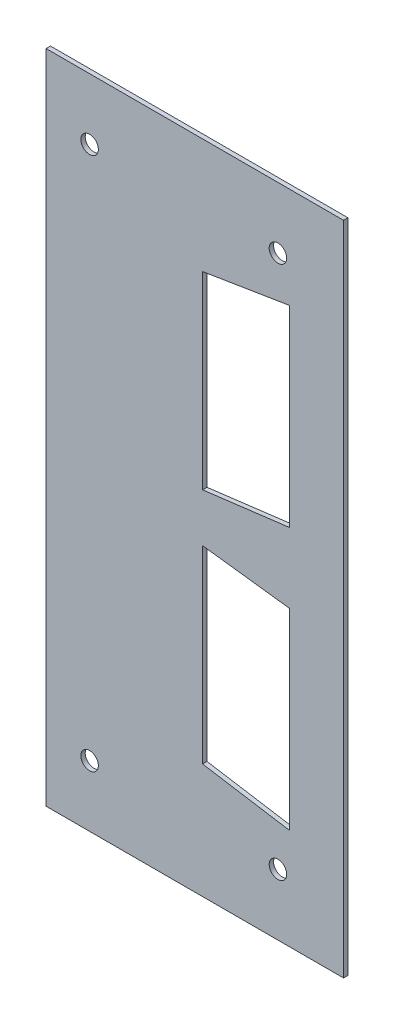
ISO-10303-21;
HEADER;
FILE_DESCRIPTION(('STEP AP214'),'2;1');
FILE_NAME('part.step','',(''),(''),'','','');
FILE_SCHEMA(('AUTOMOTIVE_DESIGN { 1 0 10303 214 1 1 1 1 }'));
ENDSEC;
DATA;
#1=APPLICATION_CONTEXT('core data for automotive mechanical design processes');
#2=APPLICATION_PROTOCOL_DEFINITION('international standard','automotive_design',2000,#1);
#3=PRODUCT_CONTEXT('',#1,'mechanical');
#4=PRODUCT('Part','Part','',(#3));
#5=PRODUCT_RELATED_PRODUCT_CATEGORY('part','',(#4));
#6=PRODUCT_DEFINITION_FORMATION('','',#4);
#7=PRODUCT_DEFINITION_CONTEXT('part definition',#1,'design');
#8=PRODUCT_DEFINITION('design','',#6,#7);
#9=PRODUCT_DEFINITION_SHAPE('','',#8);
#10=(LENGTH_UNIT() NAMED_UNIT(*) SI_UNIT(.MILLI.,.METRE.));
#11=(NAMED_UNIT(*) PLANE_ANGLE_UNIT() SI_UNIT($,.RADIAN.));
#12=(NAMED_UNIT(*) SI_UNIT($,.STERADIAN.) SOLID_ANGLE_UNIT());
#13=UNCERTAINTY_MEASURE_WITH_UNIT(LENGTH_MEASURE(1.E-05),#10,'distance_accuracy_value','');
#14=(GEOMETRIC_REPRESENTATION_CONTEXT(3) GLOBAL_UNCERTAINTY_ASSIGNED_CONTEXT((#13)) GLOBAL_UNIT_ASSIGNED_CONTEXT((#10,
#11,#12)) REPRESENTATION_CONTEXT('',''));
#15=CARTESIAN_POINT('',(0.,0.,0.));
#16=DIRECTION('',(0.,0.,1.));
#17=DIRECTION('',(1.,0.,0.));
#18=AXIS2_PLACEMENT_3D('',#15,#16,#17);
#19=CARTESIAN_POINT('',(0.,0.,1.));
#20=DIRECTION('',(1.,0.,0.));
#21=DIRECTION('',(0.,0.,-1.));
#22=AXIS2_PLACEMENT_3D('',#19,#20,#21);
#23=PLANE('',#22);
#24=DIRECTION('',(0.,-1.,0.));
#25=VECTOR('',#24,1.);
#26=CARTESIAN_POINT('',(0.,0.,0.));
#27=LINE('',#26,#25);
#28=CARTESIAN_POINT('',(0.,150.,0.));
#29=VERTEX_POINT('',#28);
#30=CARTESIAN_POINT('',(0.,0.,0.));
#31=VERTEX_POINT('',#30);
#32=EDGE_CURVE('E219',#29,#31,#27,.T.);
#33=ORIENTED_EDGE('',*,*,#32,.T.);
#34=DIRECTION('',(0.,0.,-1.));
#35=VECTOR('',#34,1.);
#36=CARTESIAN_POINT('',(0.,0.,1.));
#37=LINE('',#36,#35);
#38=CARTESIAN_POINT('',(0.,0.,1.));
#39=VERTEX_POINT('',#38);
#40=EDGE_CURVE('E11',#39,#31,#37,.T.);
#41=ORIENTED_EDGE('',*,*,#40,.F.);
#42=DIRECTION('',(0.,-1.,0.));
#43=VECTOR('',#42,1.);
#44=CARTESIAN_POINT('',(0.,0.,1.));
#45=LINE('',#44,#43);
#46=CARTESIAN_POINT('',(0.,150.,1.));
#47=VERTEX_POINT('',#46);
#48=EDGE_CURVE('E222',#47,#39,#45,.T.);
#49=ORIENTED_EDGE('',*,*,#48,.F.);
#50=DIRECTION('',(0.,0.,-1.));
#51=VECTOR('',#50,1.);
#52=CARTESIAN_POINT('',(0.,150.,1.));
#53=LINE('',#52,#51);
#54=EDGE_CURVE('E232',#47,#29,#53,.T.);
#55=ORIENTED_EDGE('',*,*,#54,.T.);
#56=EDGE_LOOP('',(#33,#41,#49,#55));
#57=FACE_BOUND('',#56,.T.);
#58=ADVANCED_FACE('F39',(#57),#23,.F.);
#59=CARTESIAN_POINT('',(0.,0.,1.));
#60=DIRECTION('',(0.,1.,0.));
#61=DIRECTION('',(0.,0.,1.));
#62=AXIS2_PLACEMENT_3D('',#59,#60,#61);
#63=PLANE('',#62);
#64=DIRECTION('',(1.,0.,0.));
#65=VECTOR('',#64,1.);
#66=CARTESIAN_POINT('',(0.,0.,0.));
#67=LINE('',#66,#65);
#68=CARTESIAN_POINT('',(68.,0.,0.));
#69=VERTEX_POINT('',#68);
#70=EDGE_CURVE('E235',#31,#69,#67,.T.);
#71=ORIENTED_EDGE('',*,*,#70,.T.);
#72=DIRECTION('',(0.,0.,-1.));
#73=VECTOR('',#72,1.);
#74=CARTESIAN_POINT('',(68.,0.,1.));
#75=LINE('',#74,#73);
#76=CARTESIAN_POINT('',(68.,0.,1.));
#77=VERTEX_POINT('',#76);
#78=EDGE_CURVE('E46',#77,#69,#75,.T.);
#79=ORIENTED_EDGE('',*,*,#78,.F.);
#80=DIRECTION('',(1.,0.,0.));
#81=VECTOR('',#80,1.);
#82=CARTESIAN_POINT('',(0.,0.,1.));
#83=LINE('',#82,#81);
#84=EDGE_CURVE('E225',#39,#77,#83,.T.);
#85=ORIENTED_EDGE('',*,*,#84,.F.);
#86=ORIENTED_EDGE('',*,*,#40,.T.);
#87=EDGE_LOOP('',(#71,#79,#85,#86));
#88=FACE_BOUND('',#87,.T.);
#89=ADVANCED_FACE('F264',(#88),#63,.F.);
#90=CARTESIAN_POINT('',(68.,0.,1.));
#91=DIRECTION('',(-1.,0.,0.));
#92=DIRECTION('',(0.,0.,1.));
#93=AXIS2_PLACEMENT_3D('',#90,#91,#92);
#94=PLANE('',#93);
#95=DIRECTION('',(0.,1.,0.));
#96=VECTOR('',#95,1.);
#97=CARTESIAN_POINT('',(68.,0.,0.));
#98=LINE('',#97,#96);
#99=CARTESIAN_POINT('',(68.,150.,0.));
#100=VERTEX_POINT('',#99);
#101=EDGE_CURVE('E237',#69,#100,#98,.T.);
#102=ORIENTED_EDGE('',*,*,#101,.T.);
#103=DIRECTION('',(0.,0.,-1.));
#104=VECTOR('',#103,1.);
#105=CARTESIAN_POINT('',(68.,150.,1.));
#106=LINE('',#105,#104);
#107=CARTESIAN_POINT('',(68.,150.,1.));
#108=VERTEX_POINT('',#107);
#109=EDGE_CURVE('E242',#108,#100,#106,.T.);
#110=ORIENTED_EDGE('',*,*,#109,.F.);
#111=DIRECTION('',(0.,1.,0.));
#112=VECTOR('',#111,1.);
#113=CARTESIAN_POINT('',(68.,0.,1.));
#114=LINE('',#113,#112);
#115=EDGE_CURVE('E228',#77,#108,#114,.T.);
#116=ORIENTED_EDGE('',*,*,#115,.F.);
#117=ORIENTED_EDGE('',*,*,#78,.T.);
#118=EDGE_LOOP('',(#102,#110,#116,#117));
#119=FACE_BOUND('',#118,.T.);
#120=ADVANCED_FACE('F249',(#119),#94,.F.);
#121=CARTESIAN_POINT('',(0.,150.,1.));
#122=DIRECTION('',(0.,-1.,0.));
#123=DIRECTION('',(0.,0.,-1.));
#124=AXIS2_PLACEMENT_3D('',#121,#122,#123);
#125=PLANE('',#124);
#126=DIRECTION('',(-1.,0.,0.));
#127=VECTOR('',#126,1.);
#128=CARTESIAN_POINT('',(0.,150.,0.));
#129=LINE('',#128,#127);
#130=EDGE_CURVE('E226',#100,#29,#129,.T.);
#131=ORIENTED_EDGE('',*,*,#130,.T.);
#132=ORIENTED_EDGE('',*,*,#54,.F.);
#133=DIRECTION('',(-1.,0.,0.));
#134=VECTOR('',#133,1.);
#135=CARTESIAN_POINT('',(0.,150.,1.));
#136=LINE('',#135,#134);
#137=EDGE_CURVE('E230',#108,#47,#136,.T.);
#138=ORIENTED_EDGE('',*,*,#137,.F.);
#139=ORIENTED_EDGE('',*,*,#109,.T.);
#140=EDGE_LOOP('',(#131,#132,#138,#139));
#141=FACE_BOUND('',#140,.T.);
#142=ADVANCED_FACE('F257',(#141),#125,.F.);
#143=CARTESIAN_POINT('',(0.,0.,1.));
#144=DIRECTION('',(0.,0.,-1.));
#145=DIRECTION('',(-1.,0.,0.));
#146=AXIS2_PLACEMENT_3D('',#143,#144,#145);
#147=PLANE('',#146);
#148=DIRECTION('',(0.,-1.,0.));
#149=VECTOR('',#148,1.);
#150=CARTESIAN_POINT('',(55.64,0.,1.));
#151=LINE('',#150,#149);
#152=CARTESIAN_POINT('',(55.64,126.96,1.));
#153=VERTEX_POINT('',#152);
#154=CARTESIAN_POINT('',(55.64,83.01,1.));
#155=VERTEX_POINT('',#154);
#156=EDGE_CURVE('E191',#153,#155,#151,.T.);
#157=ORIENTED_EDGE('',*,*,#156,.T.);
#158=DIRECTION('',(-0.99229324275717,-0.123911744312074,0.));
#159=VECTOR('',#158,1.);
#160=CARTESIAN_POINT('',(-9.35233959607563,74.8941388621214,1.));
#161=LINE('',#160,#159);
#162=CARTESIAN_POINT('',(35.78,80.53,1.));
#163=VERTEX_POINT('',#162);
#164=EDGE_CURVE('E194',#155,#163,#161,.T.);
#165=ORIENTED_EDGE('',*,*,#164,.T.);
#166=DIRECTION('',(0.,1.,0.));
#167=VECTOR('',#166,1.);
#168=CARTESIAN_POINT('',(35.78,0.,1.));
#169=LINE('',#168,#167);
#170=CARTESIAN_POINT('',(35.78,123.74,1.));
#171=VERTEX_POINT('',#170);
#172=EDGE_CURVE('E188',#163,#171,#169,.T.);
#173=ORIENTED_EDGE('',*,*,#172,.T.);
#174=DIRECTION('',(0.98710972253156,0.160044980188903,0.));
#175=VECTOR('',#174,1.);
#176=CARTESIAN_POINT('',(-18.6322041562497,114.917880292894,1.));
#177=LINE('',#176,#175);
#178=EDGE_CURVE('E132',#171,#153,#177,.T.);
#179=ORIENTED_EDGE('',*,*,#178,.T.);
#180=EDGE_LOOP('',(#157,#165,#173,#179));
#181=FACE_BOUND('',#180,.T.);
#182=DIRECTION('',(0.99229324275717,-0.123911744312074,0.));
#183=VECTOR('',#182,1.);
#184=CARTESIAN_POINT('',(9.09117839079316,72.8027430811094,1.));
#185=LINE('',#184,#183);
#186=CARTESIAN_POINT('',(35.78,69.47,1.));
#187=VERTEX_POINT('',#186);
#188=CARTESIAN_POINT('',(55.64,66.99,1.));
#189=VERTEX_POINT('',#188);
#190=EDGE_CURVE('E182',#187,#189,#185,.T.);
#191=ORIENTED_EDGE('',*,*,#190,.T.);
#192=DIRECTION('',(0.,-1.,0.));
#193=VECTOR('',#192,1.);
#194=CARTESIAN_POINT('',(55.64,0.,1.));
#195=LINE('',#194,#193);
#196=CARTESIAN_POINT('',(55.64,23.04,1.));
#197=VERTEX_POINT('',#196);
#198=EDGE_CURVE('E185',#189,#197,#195,.T.);
#199=ORIENTED_EDGE('',*,*,#198,.T.);
#200=DIRECTION('',(-0.98710972253156,0.160044980188903,0.));
#201=VECTOR('',#200,1.);
#202=CARTESIAN_POINT('',(5.06508924177594,31.239960354556,1.));
#203=LINE('',#202,#201);
#204=CARTESIAN_POINT('',(35.78,26.26,1.));
#205=VERTEX_POINT('',#204);
#206=EDGE_CURVE('E156',#197,#205,#203,.T.);
#207=ORIENTED_EDGE('',*,*,#206,.T.);
#208=DIRECTION('',(0.,1.,0.));
#209=VECTOR('',#208,1.);
#210=CARTESIAN_POINT('',(35.78,0.,1.));
#211=LINE('',#210,#209);
#212=EDGE_CURVE('E179',#205,#187,#211,.T.);
#213=ORIENTED_EDGE('',*,*,#212,.T.);
#214=EDGE_LOOP('',(#191,#199,#207,#213));
#215=FACE_BOUND('',#214,.T.);
#216=CARTESIAN_POINT('',(9.95000000000001,136.,1.));
#217=DIRECTION('',(0.,0.,1.));
#218=DIRECTION('',(-1.,0.,0.));
#219=AXIS2_PLACEMENT_3D('',#216,#217,#218);
#220=CIRCLE('',#219,2.);
#221=CARTESIAN_POINT('',(7.95000000000001,136.,1.));
#222=VERTEX_POINT('',#221);
#223=EDGE_CURVE('E197',#222,#222,#220,.T.);
#224=ORIENTED_EDGE('',*,*,#223,.F.);
#225=EDGE_LOOP('',(#224));
#226=FACE_BOUND('',#225,.T.);
#227=CARTESIAN_POINT('',(53.,136.,1.));
#228=DIRECTION('',(0.,0.,1.));
#229=DIRECTION('',(-1.,0.,0.));
#230=AXIS2_PLACEMENT_3D('',#227,#228,#229);
#231=CIRCLE('',#230,2.);
#232=CARTESIAN_POINT('',(51.,136.,1.));
#233=VERTEX_POINT('',#232);
#234=EDGE_CURVE('E208',#233,#233,#231,.T.);
#235=ORIENTED_EDGE('',*,*,#234,.F.);
#236=EDGE_LOOP('',(#235));
#237=FACE_BOUND('',#236,.T.);
#238=CARTESIAN_POINT('',(53.,14.,1.));
#239=DIRECTION('',(0.,0.,1.));
#240=DIRECTION('',(1.,0.,0.));
#241=AXIS2_PLACEMENT_3D('',#238,#239,#240);
#242=CIRCLE('',#241,2.);
#243=CARTESIAN_POINT('',(55.,14.,1.));
#244=VERTEX_POINT('',#243);
#245=EDGE_CURVE('E202',#244,#244,#242,.T.);
#246=ORIENTED_EDGE('',*,*,#245,.F.);
#247=EDGE_LOOP('',(#246));
#248=FACE_BOUND('',#247,.T.);
#249=CARTESIAN_POINT('',(9.95000000000001,14.,1.));
#250=DIRECTION('',(0.,0.,1.));
#251=DIRECTION('',(1.,0.,0.));
#252=AXIS2_PLACEMENT_3D('',#249,#250,#251);
#253=CIRCLE('',#252,2.);
#254=CARTESIAN_POINT('',(11.95,14.,1.));
#255=VERTEX_POINT('',#254);
#256=EDGE_CURVE('E201',#255,#255,#253,.T.);
#257=ORIENTED_EDGE('',*,*,#256,.F.);
#258=EDGE_LOOP('',(#257));
#259=FACE_BOUND('',#258,.T.);
#260=ORIENTED_EDGE('',*,*,#48,.T.);
#261=ORIENTED_EDGE('',*,*,#84,.T.);
#262=ORIENTED_EDGE('',*,*,#115,.T.);
#263=ORIENTED_EDGE('',*,*,#137,.T.);
#264=EDGE_LOOP('',(#260,#261,#262,#263));
#265=FACE_BOUND('',#264,.T.);
#266=ADVANCED_FACE('F263',(#181,#215,#226,#237,#248,#259,#265),#147,.F.);
#267=CARTESIAN_POINT('',(0.,0.,0.));
#268=DIRECTION('',(0.,0.,-1.));
#269=DIRECTION('',(-1.,0.,0.));
#270=AXIS2_PLACEMENT_3D('',#267,#268,#269);
#271=PLANE('',#270);
#272=DIRECTION('',(-0.99229324275717,-0.123911744312074,0.));
#273=VECTOR('',#272,1.);
#274=CARTESIAN_POINT('',(55.64,83.01,0.));
#275=LINE('',#274,#273);
#276=CARTESIAN_POINT('',(55.64,83.01,0.));
#277=VERTEX_POINT('',#276);
#278=CARTESIAN_POINT('',(35.78,80.53,0.));
#279=VERTEX_POINT('',#278);
#280=EDGE_CURVE('E144',#277,#279,#275,.T.);
#281=ORIENTED_EDGE('',*,*,#280,.F.);
#282=DIRECTION('',(0.,-1.,0.));
#283=VECTOR('',#282,1.);
#284=CARTESIAN_POINT('',(55.64,126.96,0.));
#285=LINE('',#284,#283);
#286=CARTESIAN_POINT('',(55.64,126.96,0.));
#287=VERTEX_POINT('',#286);
#288=EDGE_CURVE('E149',#287,#277,#285,.T.);
#289=ORIENTED_EDGE('',*,*,#288,.F.);
#290=DIRECTION('',(0.98710972253156,0.160044980188903,0.));
#291=VECTOR('',#290,1.);
#292=CARTESIAN_POINT('',(35.78,123.74,0.));
#293=LINE('',#292,#291);
#294=CARTESIAN_POINT('',(35.78,123.74,0.));
#295=VERTEX_POINT('',#294);
#296=EDGE_CURVE('E129',#295,#287,#293,.T.);
#297=ORIENTED_EDGE('',*,*,#296,.F.);
#298=DIRECTION('',(0.,1.,0.));
#299=VECTOR('',#298,1.);
#300=CARTESIAN_POINT('',(35.78,80.53,0.));
#301=LINE('',#300,#299);
#302=EDGE_CURVE('E139',#279,#295,#301,.T.);
#303=ORIENTED_EDGE('',*,*,#302,.F.);
#304=EDGE_LOOP('',(#281,#289,#297,#303));
#305=FACE_BOUND('',#304,.T.);
#306=DIRECTION('',(0.,-1.,0.));
#307=VECTOR('',#306,1.);
#308=CARTESIAN_POINT('',(55.64,23.04,0.));
#309=LINE('',#308,#307);
#310=CARTESIAN_POINT('',(55.64,66.99,0.));
#311=VERTEX_POINT('',#310);
#312=CARTESIAN_POINT('',(55.64,23.04,0.));
#313=VERTEX_POINT('',#312);
#314=EDGE_CURVE('E159',#311,#313,#309,.T.);
#315=ORIENTED_EDGE('',*,*,#314,.F.);
#316=DIRECTION('',(0.99229324275717,-0.123911744312074,0.));
#317=VECTOR('',#316,1.);
#318=CARTESIAN_POINT('',(55.64,66.99,0.));
#319=LINE('',#318,#317);
#320=CARTESIAN_POINT('',(35.78,69.47,0.));
#321=VERTEX_POINT('',#320);
#322=EDGE_CURVE('E166',#321,#311,#319,.T.);
#323=ORIENTED_EDGE('',*,*,#322,.F.);
#324=DIRECTION('',(0.,1.,0.));
#325=VECTOR('',#324,1.);
#326=CARTESIAN_POINT('',(35.78,69.47,0.));
#327=LINE('',#326,#325);
#328=CARTESIAN_POINT('',(35.78,26.26,0.));
#329=VERTEX_POINT('',#328);
#330=EDGE_CURVE('E163',#329,#321,#327,.T.);
#331=ORIENTED_EDGE('',*,*,#330,.F.);
#332=DIRECTION('',(-0.98710972253156,0.160044980188903,0.));
#333=VECTOR('',#332,1.);
#334=CARTESIAN_POINT('',(35.78,26.26,0.));
#335=LINE('',#334,#333);
#336=EDGE_CURVE('E161',#313,#329,#335,.T.);
#337=ORIENTED_EDGE('',*,*,#336,.F.);
#338=EDGE_LOOP('',(#315,#323,#331,#337));
#339=FACE_BOUND('',#338,.T.);
#340=CARTESIAN_POINT('',(9.95000000000001,136.,0.));
#341=DIRECTION('',(0.,0.,1.));
#342=DIRECTION('',(-1.,0.,0.));
#343=AXIS2_PLACEMENT_3D('',#340,#341,#342);
#344=CIRCLE('',#343,2.);
#345=CARTESIAN_POINT('',(7.95000000000001,136.,0.));
#346=VERTEX_POINT('',#345);
#347=EDGE_CURVE('E211',#346,#346,#344,.T.);
#348=ORIENTED_EDGE('',*,*,#347,.T.);
#349=EDGE_LOOP('',(#348));
#350=FACE_BOUND('',#349,.T.);
#351=CARTESIAN_POINT('',(53.,136.,0.));
#352=DIRECTION('',(0.,0.,1.));
#353=DIRECTION('',(-1.,0.,0.));
#354=AXIS2_PLACEMENT_3D('',#351,#352,#353);
#355=CIRCLE('',#354,2.);
#356=CARTESIAN_POINT('',(51.,136.,0.));
#357=VERTEX_POINT('',#356);
#358=EDGE_CURVE('E205',#357,#357,#355,.T.);
#359=ORIENTED_EDGE('',*,*,#358,.T.);
#360=EDGE_LOOP('',(#359));
#361=FACE_BOUND('',#360,.T.);
#362=CARTESIAN_POINT('',(53.,14.,0.));
#363=DIRECTION('',(0.,0.,1.));
#364=DIRECTION('',(1.,0.,0.));
#365=AXIS2_PLACEMENT_3D('',#362,#363,#364);
#366=CIRCLE('',#365,2.);
#367=CARTESIAN_POINT('',(55.,14.,0.));
#368=VERTEX_POINT('',#367);
#369=EDGE_CURVE('E198',#368,#368,#366,.T.);
#370=ORIENTED_EDGE('',*,*,#369,.T.);
#371=EDGE_LOOP('',(#370));
#372=FACE_BOUND('',#371,.T.);
#373=CARTESIAN_POINT('',(9.95000000000001,14.,0.));
#374=DIRECTION('',(0.,0.,1.));
#375=DIRECTION('',(1.,0.,0.));
#376=AXIS2_PLACEMENT_3D('',#373,#374,#375);
#377=CIRCLE('',#376,2.);
#378=CARTESIAN_POINT('',(11.95,14.,0.));
#379=VERTEX_POINT('',#378);
#380=EDGE_CURVE('E216',#379,#379,#377,.T.);
#381=ORIENTED_EDGE('',*,*,#380,.T.);
#382=EDGE_LOOP('',(#381));
#383=FACE_BOUND('',#382,.T.);
#384=ORIENTED_EDGE('',*,*,#32,.F.);
#385=ORIENTED_EDGE('',*,*,#130,.F.);
#386=ORIENTED_EDGE('',*,*,#101,.F.);
#387=ORIENTED_EDGE('',*,*,#70,.F.);
#388=EDGE_LOOP('',(#384,#385,#386,#387));
#389=FACE_BOUND('',#388,.T.);
#390=ADVANCED_FACE('F146',(#305,#339,#350,#361,#372,#383,#389),#271,.T.);
#391=CARTESIAN_POINT('',(9.95000000000001,14.,0.));
#392=DIRECTION('',(0.,0.,1.));
#393=DIRECTION('',(1.,0.,0.));
#394=AXIS2_PLACEMENT_3D('',#391,#392,#393);
#395=CYLINDRICAL_SURFACE('',#394,2.);
#396=ORIENTED_EDGE('',*,*,#380,.F.);
#397=EDGE_LOOP('',(#396));
#398=FACE_BOUND('',#397,.T.);
#399=ORIENTED_EDGE('',*,*,#256,.T.);
#400=EDGE_LOOP('',(#399));
#401=FACE_BOUND('',#400,.T.);
#402=ADVANCED_FACE('F276',(#398,#401),#395,.F.);
#403=CARTESIAN_POINT('',(53.,14.,0.));
#404=DIRECTION('',(0.,0.,1.));
#405=DIRECTION('',(1.,0.,0.));
#406=AXIS2_PLACEMENT_3D('',#403,#404,#405);
#407=CYLINDRICAL_SURFACE('',#406,2.);
#408=ORIENTED_EDGE('',*,*,#369,.F.);
#409=EDGE_LOOP('',(#408));
#410=FACE_BOUND('',#409,.T.);
#411=ORIENTED_EDGE('',*,*,#245,.T.);
#412=EDGE_LOOP('',(#411));
#413=FACE_BOUND('',#412,.T.);
#414=ADVANCED_FACE('F282',(#410,#413),#407,.F.);
#415=CARTESIAN_POINT('',(53.,136.,0.));
#416=DIRECTION('',(0.,0.,1.));
#417=DIRECTION('',(1.,0.,0.));
#418=AXIS2_PLACEMENT_3D('',#415,#416,#417);
#419=CYLINDRICAL_SURFACE('',#418,2.);
#420=ORIENTED_EDGE('',*,*,#358,.F.);
#421=EDGE_LOOP('',(#420));
#422=FACE_BOUND('',#421,.T.);
#423=ORIENTED_EDGE('',*,*,#234,.T.);
#424=EDGE_LOOP('',(#423));
#425=FACE_BOUND('',#424,.T.);
#426=ADVANCED_FACE('F288',(#422,#425),#419,.F.);
#427=CARTESIAN_POINT('',(9.95000000000001,136.,0.));
#428=DIRECTION('',(0.,0.,1.));
#429=DIRECTION('',(1.,0.,0.));
#430=AXIS2_PLACEMENT_3D('',#427,#428,#429);
#431=CYLINDRICAL_SURFACE('',#430,2.);
#432=ORIENTED_EDGE('',*,*,#347,.F.);
#433=EDGE_LOOP('',(#432));
#434=FACE_BOUND('',#433,.T.);
#435=ORIENTED_EDGE('',*,*,#223,.T.);
#436=EDGE_LOOP('',(#435));
#437=FACE_BOUND('',#436,.T.);
#438=ADVANCED_FACE('F284',(#434,#437),#431,.F.);
#439=CARTESIAN_POINT('',(55.64,23.04,20.));
#440=DIRECTION('',(1.,0.,0.));
#441=DIRECTION('',(0.,1.,0.));
#442=AXIS2_PLACEMENT_3D('',#439,#440,#441);
#443=PLANE('',#442);
#444=DIRECTION('',(0.,0.,-1.));
#445=VECTOR('',#444,1.);
#446=CARTESIAN_POINT('',(55.64,66.99,20.));
#447=LINE('',#446,#445);
#448=EDGE_CURVE('E170',#189,#311,#447,.T.);
#449=ORIENTED_EDGE('',*,*,#448,.T.);
#450=ORIENTED_EDGE('',*,*,#314,.T.);
#451=DIRECTION('',(0.,0.,-1.));
#452=VECTOR('',#451,1.);
#453=CARTESIAN_POINT('',(55.64,23.04,20.));
#454=LINE('',#453,#452);
#455=EDGE_CURVE('E169',#197,#313,#454,.T.);
#456=ORIENTED_EDGE('',*,*,#455,.F.);
#457=ORIENTED_EDGE('',*,*,#198,.F.);
#458=EDGE_LOOP('',(#449,#450,#456,#457));
#459=FACE_BOUND('',#458,.T.);
#460=ADVANCED_FACE('F287',(#459),#443,.F.);
#461=CARTESIAN_POINT('',(55.64,66.99,20.));
#462=DIRECTION('',(0.123911744312074,0.992293242757169,0.));
#463=DIRECTION('',(-0.99229324275717,0.123911744312074,0.));
#464=AXIS2_PLACEMENT_3D('',#461,#462,#463);
#465=PLANE('',#464);
#466=DIRECTION('',(0.,0.,-1.));
#467=VECTOR('',#466,1.);
#468=CARTESIAN_POINT('',(35.78,69.47,20.));
#469=LINE('',#468,#467);
#470=EDGE_CURVE('E172',#187,#321,#469,.T.);
#471=ORIENTED_EDGE('',*,*,#470,.T.);
#472=ORIENTED_EDGE('',*,*,#322,.T.);
#473=ORIENTED_EDGE('',*,*,#448,.F.);
#474=ORIENTED_EDGE('',*,*,#190,.F.);
#475=EDGE_LOOP('',(#471,#472,#473,#474));
#476=FACE_BOUND('',#475,.T.);
#477=ADVANCED_FACE('F298',(#476),#465,.F.);
#478=CARTESIAN_POINT('',(35.78,69.47,20.));
#479=DIRECTION('',(-1.,0.,0.));
#480=DIRECTION('',(0.,0.,1.));
#481=AXIS2_PLACEMENT_3D('',#478,#479,#480);
#482=PLANE('',#481);
#483=DIRECTION('',(0.,0.,-1.));
#484=VECTOR('',#483,1.);
#485=CARTESIAN_POINT('',(35.78,26.26,20.));
#486=LINE('',#485,#484);
#487=EDGE_CURVE('E61',#205,#329,#486,.T.);
#488=ORIENTED_EDGE('',*,*,#487,.T.);
#489=ORIENTED_EDGE('',*,*,#330,.T.);
#490=ORIENTED_EDGE('',*,*,#470,.F.);
#491=ORIENTED_EDGE('',*,*,#212,.F.);
#492=EDGE_LOOP('',(#488,#489,#490,#491));
#493=FACE_BOUND('',#492,.T.);
#494=ADVANCED_FACE('F304',(#493),#482,.F.);
#495=CARTESIAN_POINT('',(35.78,26.26,20.));
#496=DIRECTION('',(-0.160044980188903,-0.98710972253156,0.));
#497=DIRECTION('',(0.98710972253156,-0.160044980188903,0.));
#498=AXIS2_PLACEMENT_3D('',#495,#496,#497);
#499=PLANE('',#498);
#500=ORIENTED_EDGE('',*,*,#455,.T.);
#501=ORIENTED_EDGE('',*,*,#336,.T.);
#502=ORIENTED_EDGE('',*,*,#487,.F.);
#503=ORIENTED_EDGE('',*,*,#206,.F.);
#504=EDGE_LOOP('',(#500,#501,#502,#503));
#505=FACE_BOUND('',#504,.T.);
#506=ADVANCED_FACE('F300',(#505),#499,.F.);
#507=CARTESIAN_POINT('',(55.64,83.01,20.));
#508=DIRECTION('',(0.123911744312074,-0.992293242757169,0.));
#509=DIRECTION('',(0.99229324275717,0.123911744312074,0.));
#510=AXIS2_PLACEMENT_3D('',#507,#508,#509);
#511=PLANE('',#510);
#512=DIRECTION('',(0.,0.,-1.));
#513=VECTOR('',#512,1.);
#514=CARTESIAN_POINT('',(55.64,83.01,20.));
#515=LINE('',#514,#513);
#516=EDGE_CURVE('E154',#155,#277,#515,.T.);
#517=ORIENTED_EDGE('',*,*,#516,.T.);
#518=ORIENTED_EDGE('',*,*,#280,.T.);
#519=DIRECTION('',(0.,0.,-1.));
#520=VECTOR('',#519,1.);
#521=CARTESIAN_POINT('',(35.78,80.53,20.));
#522=LINE('',#521,#520);
#523=EDGE_CURVE('E135',#163,#279,#522,.T.);
#524=ORIENTED_EDGE('',*,*,#523,.F.);
#525=ORIENTED_EDGE('',*,*,#164,.F.);
#526=EDGE_LOOP('',(#517,#518,#524,#525));
#527=FACE_BOUND('',#526,.T.);
#528=ADVANCED_FACE('F303',(#527),#511,.F.);
#529=CARTESIAN_POINT('',(55.64,126.96,20.));
#530=DIRECTION('',(1.,0.,0.));
#531=DIRECTION('',(0.,1.,0.));
#532=AXIS2_PLACEMENT_3D('',#529,#530,#531);
#533=PLANE('',#532);
#534=DIRECTION('',(0.,0.,-1.));
#535=VECTOR('',#534,1.);
#536=CARTESIAN_POINT('',(55.64,126.96,20.));
#537=LINE('',#536,#535);
#538=EDGE_CURVE('E134',#153,#287,#537,.T.);
#539=ORIENTED_EDGE('',*,*,#538,.T.);
#540=ORIENTED_EDGE('',*,*,#288,.T.);
#541=ORIENTED_EDGE('',*,*,#516,.F.);
#542=ORIENTED_EDGE('',*,*,#156,.F.);
#543=EDGE_LOOP('',(#539,#540,#541,#542));
#544=FACE_BOUND('',#543,.T.);
#545=ADVANCED_FACE('F313',(#544),#533,.F.);
#546=CARTESIAN_POINT('',(35.78,123.74,20.));
#547=DIRECTION('',(-0.160044980188903,0.98710972253156,0.));
#548=DIRECTION('',(-0.98710972253156,-0.160044980188903,0.));
#549=AXIS2_PLACEMENT_3D('',#546,#547,#548);
#550=PLANE('',#549);
#551=DIRECTION('',(0.,0.,-1.));
#552=VECTOR('',#551,1.);
#553=CARTESIAN_POINT('',(35.78,123.74,20.));
#554=LINE('',#553,#552);
#555=EDGE_CURVE('E53',#171,#295,#554,.T.);
#556=ORIENTED_EDGE('',*,*,#555,.T.);
#557=ORIENTED_EDGE('',*,*,#296,.T.);
#558=ORIENTED_EDGE('',*,*,#538,.F.);
#559=ORIENTED_EDGE('',*,*,#178,.F.);
#560=EDGE_LOOP('',(#556,#557,#558,#559));
#561=FACE_BOUND('',#560,.T.);
#562=ADVANCED_FACE('F126',(#561),#550,.F.);
#563=CARTESIAN_POINT('',(35.78,80.53,20.));
#564=DIRECTION('',(-1.,0.,0.));
#565=DIRECTION('',(0.,0.,1.));
#566=AXIS2_PLACEMENT_3D('',#563,#564,#565);
#567=PLANE('',#566);
#568=ORIENTED_EDGE('',*,*,#523,.T.);
#569=ORIENTED_EDGE('',*,*,#302,.T.);
#570=ORIENTED_EDGE('',*,*,#555,.F.);
#571=ORIENTED_EDGE('',*,*,#172,.F.);
#572=EDGE_LOOP('',(#568,#569,#570,#571));
#573=FACE_BOUND('',#572,.T.);
#574=ADVANCED_FACE('F140',(#573),#567,.F.);
#575=CLOSED_SHELL('',(#58,#89,#120,#142,#266,#390,#402,#414,#426,#438,#460,#477,#494,#506,#528,
#545,#562,#574));
#576=MANIFOLD_SOLID_BREP('B2',#575);
#577=ADVANCED_BREP_SHAPE_REPRESENTATION('',(#18,#576),#14);
#578=SHAPE_DEFINITION_REPRESENTATION(#9,#577);
ENDSEC;
END-ISO-10303-21;
